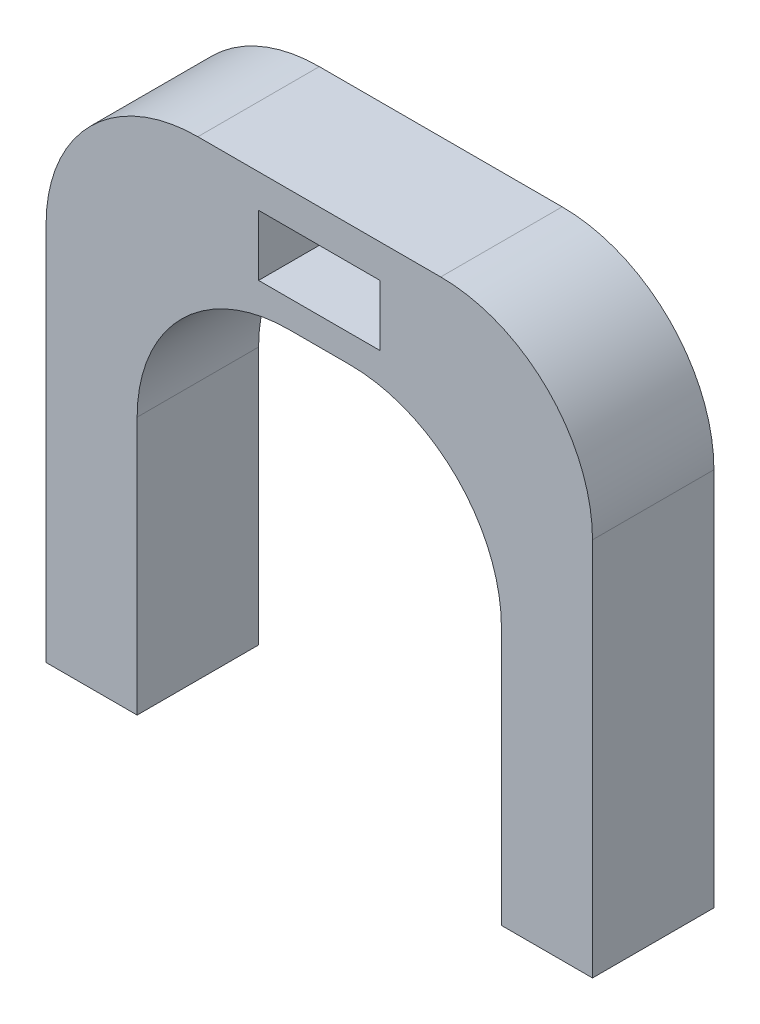
ISO-10303-21;
HEADER;
FILE_DESCRIPTION(('STEP AP214'),'2;1');
FILE_NAME('part.step','',(''),(''),'','','');
FILE_SCHEMA(('AUTOMOTIVE_DESIGN { 1 0 10303 214 1 1 1 1 }'));
ENDSEC;
DATA;
#1=APPLICATION_CONTEXT('core data for automotive mechanical design processes');
#2=APPLICATION_PROTOCOL_DEFINITION('international standard','automotive_design',2000,#1);
#3=PRODUCT_CONTEXT('',#1,'mechanical');
#4=PRODUCT('Part','Part','',(#3));
#5=PRODUCT_RELATED_PRODUCT_CATEGORY('part','',(#4));
#6=PRODUCT_DEFINITION_FORMATION('','',#4);
#7=PRODUCT_DEFINITION_CONTEXT('part definition',#1,'design');
#8=PRODUCT_DEFINITION('design','',#6,#7);
#9=PRODUCT_DEFINITION_SHAPE('','',#8);
#10=(LENGTH_UNIT() NAMED_UNIT(*) SI_UNIT(.MILLI.,.METRE.));
#11=(NAMED_UNIT(*) PLANE_ANGLE_UNIT() SI_UNIT($,.RADIAN.));
#12=(NAMED_UNIT(*) SI_UNIT($,.STERADIAN.) SOLID_ANGLE_UNIT());
#13=UNCERTAINTY_MEASURE_WITH_UNIT(LENGTH_MEASURE(1.E-05),#10,'distance_accuracy_value','');
#14=(GEOMETRIC_REPRESENTATION_CONTEXT(3) GLOBAL_UNCERTAINTY_ASSIGNED_CONTEXT((#13)) GLOBAL_UNIT_ASSIGNED_CONTEXT((#10,
#11,#12)) REPRESENTATION_CONTEXT('',''));
#15=CARTESIAN_POINT('',(0.,0.,0.));
#16=DIRECTION('',(0.,0.,1.));
#17=DIRECTION('',(1.,0.,0.));
#18=AXIS2_PLACEMENT_3D('',#15,#16,#17);
#19=CARTESIAN_POINT('',(0.,0.,4.));
#20=DIRECTION('',(1.,0.,0.));
#21=DIRECTION('',(0.,0.,-1.));
#22=AXIS2_PLACEMENT_3D('',#19,#20,#21);
#23=PLANE('',#22);
#24=DIRECTION('',(0.,-1.,0.));
#25=VECTOR('',#24,1.);
#26=CARTESIAN_POINT('',(0.,0.,0.));
#27=LINE('',#26,#25);
#28=CARTESIAN_POINT('',(0.,16.5,0.));
#29=VERTEX_POINT('',#28);
#30=CARTESIAN_POINT('',(0.,4.,0.));
#31=VERTEX_POINT('',#30);
#32=EDGE_CURVE('E167',#29,#31,#27,.T.);
#33=ORIENTED_EDGE('',*,*,#32,.T.);
#34=DIRECTION('',(0.,0.,1.));
#35=VECTOR('',#34,1.);
#36=CARTESIAN_POINT('',(0.,4.,0.));
#37=LINE('',#36,#35);
#38=CARTESIAN_POINT('',(0.,4.,4.));
#39=VERTEX_POINT('',#38);
#40=EDGE_CURVE('E286',#31,#39,#37,.T.);
#41=ORIENTED_EDGE('',*,*,#40,.T.);
#42=DIRECTION('',(0.,-1.,0.));
#43=VECTOR('',#42,1.);
#44=CARTESIAN_POINT('',(0.,0.,4.));
#45=LINE('',#44,#43);
#46=CARTESIAN_POINT('',(0.,16.5,4.));
#47=VERTEX_POINT('',#46);
#48=EDGE_CURVE('E170',#47,#39,#45,.T.);
#49=ORIENTED_EDGE('',*,*,#48,.F.);
#50=DIRECTION('',(0.,0.,-1.));
#51=VECTOR('',#50,1.);
#52=CARTESIAN_POINT('',(0.,16.5,4.));
#53=LINE('',#52,#51);
#54=EDGE_CURVE('E11',#47,#29,#53,.T.);
#55=ORIENTED_EDGE('',*,*,#54,.T.);
#56=EDGE_LOOP('',(#33,#41,#49,#55));
#57=FACE_BOUND('',#56,.T.);
#58=ADVANCED_FACE('F33',(#57),#23,.F.);
#59=CARTESIAN_POINT('',(18.,0.,4.));
#60=DIRECTION('',(-1.,0.,0.));
#61=DIRECTION('',(0.,0.,1.));
#62=AXIS2_PLACEMENT_3D('',#59,#60,#61);
#63=PLANE('',#62);
#64=DIRECTION('',(0.,1.,0.));
#65=VECTOR('',#64,1.);
#66=CARTESIAN_POINT('',(18.,0.,4.));
#67=LINE('',#66,#65);
#68=CARTESIAN_POINT('',(18.,4.,4.));
#69=VERTEX_POINT('',#68);
#70=CARTESIAN_POINT('',(18.,16.5,4.));
#71=VERTEX_POINT('',#70);
#72=EDGE_CURVE('E159',#69,#71,#67,.T.);
#73=ORIENTED_EDGE('',*,*,#72,.F.);
#74=DIRECTION('',(0.,0.,1.));
#75=VECTOR('',#74,1.);
#76=CARTESIAN_POINT('',(18.,4.,0.));
#77=LINE('',#76,#75);
#78=CARTESIAN_POINT('',(18.,4.,0.));
#79=VERTEX_POINT('',#78);
#80=EDGE_CURVE('E147',#79,#69,#77,.T.);
#81=ORIENTED_EDGE('',*,*,#80,.F.);
#82=DIRECTION('',(0.,1.,0.));
#83=VECTOR('',#82,1.);
#84=CARTESIAN_POINT('',(18.,0.,0.));
#85=LINE('',#84,#83);
#86=CARTESIAN_POINT('',(18.,16.5,0.));
#87=VERTEX_POINT('',#86);
#88=EDGE_CURVE('E157',#79,#87,#85,.T.);
#89=ORIENTED_EDGE('',*,*,#88,.T.);
#90=DIRECTION('',(0.,0.,-1.));
#91=VECTOR('',#90,1.);
#92=CARTESIAN_POINT('',(18.,16.5,4.));
#93=LINE('',#92,#91);
#94=EDGE_CURVE('E206',#87,#71,#93,.F.);
#95=ORIENTED_EDGE('',*,*,#94,.T.);
#96=EDGE_LOOP('',(#73,#81,#89,#95));
#97=FACE_BOUND('',#96,.T.);
#98=ADVANCED_FACE('F155',(#97),#63,.F.);
#99=CARTESIAN_POINT('',(0.,21.5,4.));
#100=DIRECTION('',(0.,-1.,0.));
#101=DIRECTION('',(0.,0.,-1.));
#102=AXIS2_PLACEMENT_3D('',#99,#100,#101);
#103=PLANE('',#102);
#104=DIRECTION('',(-1.,0.,0.));
#105=VECTOR('',#104,1.);
#106=CARTESIAN_POINT('',(0.,21.5,4.));
#107=LINE('',#106,#105);
#108=CARTESIAN_POINT('',(13.,21.5,4.));
#109=VERTEX_POINT('',#108);
#110=CARTESIAN_POINT('',(5.,21.5,4.));
#111=VERTEX_POINT('',#110);
#112=EDGE_CURVE('E180',#109,#111,#107,.T.);
#113=ORIENTED_EDGE('',*,*,#112,.F.);
#114=DIRECTION('',(0.,0.,-1.));
#115=VECTOR('',#114,1.);
#116=CARTESIAN_POINT('',(13.,21.5,4.));
#117=LINE('',#116,#115);
#118=CARTESIAN_POINT('',(13.,21.5,0.));
#119=VERTEX_POINT('',#118);
#120=EDGE_CURVE('E200',#109,#119,#117,.T.);
#121=ORIENTED_EDGE('',*,*,#120,.T.);
#122=DIRECTION('',(-1.,0.,0.));
#123=VECTOR('',#122,1.);
#124=CARTESIAN_POINT('',(0.,21.5,0.));
#125=LINE('',#124,#123);
#126=CARTESIAN_POINT('',(5.,21.5,0.));
#127=VERTEX_POINT('',#126);
#128=EDGE_CURVE('E166',#119,#127,#125,.T.);
#129=ORIENTED_EDGE('',*,*,#128,.T.);
#130=DIRECTION('',(0.,0.,-1.));
#131=VECTOR('',#130,1.);
#132=CARTESIAN_POINT('',(5.,21.5,4.));
#133=LINE('',#132,#131);
#134=EDGE_CURVE('E198',#127,#111,#133,.F.);
#135=ORIENTED_EDGE('',*,*,#134,.T.);
#136=EDGE_LOOP('',(#113,#121,#129,#135));
#137=FACE_BOUND('',#136,.T.);
#138=ADVANCED_FACE('F219',(#137),#103,.F.);
#139=CARTESIAN_POINT('',(0.,0.,4.));
#140=DIRECTION('',(0.,0.,-1.));
#141=DIRECTION('',(-1.,0.,0.));
#142=AXIS2_PLACEMENT_3D('',#139,#140,#141);
#143=PLANE('',#142);
#144=DIRECTION('',(1.,0.,0.));
#145=VECTOR('',#144,1.);
#146=CARTESIAN_POINT('',(7.,18.4009479824988,4.));
#147=LINE('',#146,#145);
#148=CARTESIAN_POINT('',(7.,18.4009479824988,4.));
#149=VERTEX_POINT('',#148);
#150=CARTESIAN_POINT('',(11.,18.4009479824988,4.));
#151=VERTEX_POINT('',#150);
#152=EDGE_CURVE('E312',#149,#151,#147,.T.);
#153=ORIENTED_EDGE('',*,*,#152,.F.);
#154=DIRECTION('',(0.,-1.,0.));
#155=VECTOR('',#154,1.);
#156=CARTESIAN_POINT('',(7.,20.4009479824988,4.));
#157=LINE('',#156,#155);
#158=CARTESIAN_POINT('',(7.,20.4009479824988,4.));
#159=VERTEX_POINT('',#158);
#160=EDGE_CURVE('E295',#159,#149,#157,.T.);
#161=ORIENTED_EDGE('',*,*,#160,.F.);
#162=DIRECTION('',(-1.,0.,0.));
#163=VECTOR('',#162,1.);
#164=CARTESIAN_POINT('',(7.,20.4009479824988,4.));
#165=LINE('',#164,#163);
#166=CARTESIAN_POINT('',(11.,20.4009479824988,4.));
#167=VERTEX_POINT('',#166);
#168=EDGE_CURVE('E301',#167,#159,#165,.T.);
#169=ORIENTED_EDGE('',*,*,#168,.F.);
#170=DIRECTION('',(0.,1.,0.));
#171=VECTOR('',#170,1.);
#172=CARTESIAN_POINT('',(11.,20.4009479824988,4.));
#173=LINE('',#172,#171);
#174=EDGE_CURVE('E315',#151,#167,#173,.T.);
#175=ORIENTED_EDGE('',*,*,#174,.F.);
#176=EDGE_LOOP('',(#153,#161,#169,#175));
#177=FACE_BOUND('',#176,.T.);
#178=DIRECTION('',(0.,1.,0.));
#179=VECTOR('',#178,1.);
#180=CARTESIAN_POINT('',(15.,0.,4.));
#181=LINE('',#180,#179);
#182=CARTESIAN_POINT('',(15.,4.,4.));
#183=VERTEX_POINT('',#182);
#184=CARTESIAN_POINT('',(15.,12.5,4.));
#185=VERTEX_POINT('',#184);
#186=EDGE_CURVE('E272',#183,#185,#181,.T.);
#187=ORIENTED_EDGE('',*,*,#186,.F.);
#188=DIRECTION('',(-1.,0.,0.));
#189=VECTOR('',#188,1.);
#190=CARTESIAN_POINT('',(15.,4.,4.));
#191=LINE('',#190,#189);
#192=EDGE_CURVE('E48',#69,#183,#191,.T.);
#193=ORIENTED_EDGE('',*,*,#192,.F.);
#194=ORIENTED_EDGE('',*,*,#72,.T.);
#195=CARTESIAN_POINT('',(13.,16.5,4.));
#196=DIRECTION('',(0.,0.,-1.));
#197=DIRECTION('',(-1.,0.,0.));
#198=AXIS2_PLACEMENT_3D('',#195,#196,#197);
#199=CIRCLE('',#198,5.);
#200=EDGE_CURVE('E41',#71,#109,#199,.F.);
#201=ORIENTED_EDGE('',*,*,#200,.T.);
#202=ORIENTED_EDGE('',*,*,#112,.T.);
#203=CARTESIAN_POINT('',(5.,16.5,4.));
#204=DIRECTION('',(0.,0.,-1.));
#205=DIRECTION('',(-1.,0.,0.));
#206=AXIS2_PLACEMENT_3D('',#203,#204,#205);
#207=CIRCLE('',#206,5.);
#208=EDGE_CURVE('E208',#111,#47,#207,.F.);
#209=ORIENTED_EDGE('',*,*,#208,.T.);
#210=ORIENTED_EDGE('',*,*,#48,.T.);
#211=DIRECTION('',(-1.,0.,0.));
#212=VECTOR('',#211,1.);
#213=CARTESIAN_POINT('',(0.,4.,4.));
#214=LINE('',#213,#212);
#215=CARTESIAN_POINT('',(3.,4.,4.));
#216=VERTEX_POINT('',#215);
#217=EDGE_CURVE('E282',#216,#39,#214,.T.);
#218=ORIENTED_EDGE('',*,*,#217,.F.);
#219=DIRECTION('',(0.,-1.,0.));
#220=VECTOR('',#219,1.);
#221=CARTESIAN_POINT('',(3.,0.,4.));
#222=LINE('',#221,#220);
#223=CARTESIAN_POINT('',(3.,12.5,4.));
#224=VERTEX_POINT('',#223);
#225=EDGE_CURVE('E269',#224,#216,#222,.T.);
#226=ORIENTED_EDGE('',*,*,#225,.F.);
#227=CARTESIAN_POINT('',(8.,12.5,4.));
#228=DIRECTION('',(0.,0.,-1.));
#229=DIRECTION('',(-1.,0.,0.));
#230=AXIS2_PLACEMENT_3D('',#227,#228,#229);
#231=CIRCLE('',#230,5.);
#232=CARTESIAN_POINT('',(8.,17.5,4.));
#233=VERTEX_POINT('',#232);
#234=EDGE_CURVE('E194',#224,#233,#231,.T.);
#235=ORIENTED_EDGE('',*,*,#234,.T.);
#236=DIRECTION('',(-1.,0.,0.));
#237=VECTOR('',#236,1.);
#238=CARTESIAN_POINT('',(3.,17.5,4.));
#239=LINE('',#238,#237);
#240=CARTESIAN_POINT('',(10.,17.5,4.));
#241=VERTEX_POINT('',#240);
#242=EDGE_CURVE('E275',#241,#233,#239,.T.);
#243=ORIENTED_EDGE('',*,*,#242,.F.);
#244=CARTESIAN_POINT('',(10.,12.5,4.));
#245=DIRECTION('',(0.,0.,-1.));
#246=DIRECTION('',(-1.,0.,0.));
#247=AXIS2_PLACEMENT_3D('',#244,#245,#246);
#248=CIRCLE('',#247,5.);
#249=EDGE_CURVE('E189',#241,#185,#248,.T.);
#250=ORIENTED_EDGE('',*,*,#249,.T.);
#251=EDGE_LOOP('',(#187,#193,#194,#201,#202,#209,#210,#218,#226,#235,#243,#250));
#252=FACE_BOUND('',#251,.T.);
#253=ADVANCED_FACE('F214',(#177,#252),#143,.F.);
#254=CARTESIAN_POINT('',(0.,0.,0.));
#255=DIRECTION('',(0.,0.,-1.));
#256=DIRECTION('',(-1.,0.,0.));
#257=AXIS2_PLACEMENT_3D('',#254,#255,#256);
#258=PLANE('',#257);
#259=DIRECTION('',(-1.,0.,0.));
#260=VECTOR('',#259,1.);
#261=CARTESIAN_POINT('',(15.,4.,0.));
#262=LINE('',#261,#260);
#263=CARTESIAN_POINT('',(15.,4.,0.));
#264=VERTEX_POINT('',#263);
#265=EDGE_CURVE('E144',#79,#264,#262,.T.);
#266=ORIENTED_EDGE('',*,*,#265,.T.);
#267=DIRECTION('',(0.,1.,0.));
#268=VECTOR('',#267,1.);
#269=CARTESIAN_POINT('',(15.,0.,0.));
#270=LINE('',#269,#268);
#271=CARTESIAN_POINT('',(15.,12.5,0.));
#272=VERTEX_POINT('',#271);
#273=EDGE_CURVE('E259',#264,#272,#270,.T.);
#274=ORIENTED_EDGE('',*,*,#273,.T.);
#275=CARTESIAN_POINT('',(10.,12.5,0.));
#276=DIRECTION('',(0.,0.,-1.));
#277=DIRECTION('',(-1.,0.,0.));
#278=AXIS2_PLACEMENT_3D('',#275,#276,#277);
#279=CIRCLE('',#278,5.);
#280=CARTESIAN_POINT('',(10.,17.5,0.));
#281=VERTEX_POINT('',#280);
#282=EDGE_CURVE('E192',#272,#281,#279,.F.);
#283=ORIENTED_EDGE('',*,*,#282,.T.);
#284=DIRECTION('',(-1.,0.,0.));
#285=VECTOR('',#284,1.);
#286=CARTESIAN_POINT('',(3.,17.5,0.));
#287=LINE('',#286,#285);
#288=CARTESIAN_POINT('',(8.,17.5,0.));
#289=VERTEX_POINT('',#288);
#290=EDGE_CURVE('E173',#281,#289,#287,.T.);
#291=ORIENTED_EDGE('',*,*,#290,.T.);
#292=CARTESIAN_POINT('',(8.,12.5,0.));
#293=DIRECTION('',(0.,0.,-1.));
#294=DIRECTION('',(-1.,0.,0.));
#295=AXIS2_PLACEMENT_3D('',#292,#293,#294);
#296=CIRCLE('',#295,5.);
#297=CARTESIAN_POINT('',(3.,12.5,0.));
#298=VERTEX_POINT('',#297);
#299=EDGE_CURVE('E196',#289,#298,#296,.F.);
#300=ORIENTED_EDGE('',*,*,#299,.T.);
#301=DIRECTION('',(0.,-1.,0.));
#302=VECTOR('',#301,1.);
#303=CARTESIAN_POINT('',(3.,0.,0.));
#304=LINE('',#303,#302);
#305=CARTESIAN_POINT('',(3.,4.,0.));
#306=VERTEX_POINT('',#305);
#307=EDGE_CURVE('E265',#298,#306,#304,.T.);
#308=ORIENTED_EDGE('',*,*,#307,.T.);
#309=DIRECTION('',(-1.,0.,0.));
#310=VECTOR('',#309,1.);
#311=CARTESIAN_POINT('',(0.,4.,0.));
#312=LINE('',#311,#310);
#313=EDGE_CURVE('E56',#306,#31,#312,.T.);
#314=ORIENTED_EDGE('',*,*,#313,.T.);
#315=ORIENTED_EDGE('',*,*,#32,.F.);
#316=CARTESIAN_POINT('',(5.,16.5,0.));
#317=DIRECTION('',(0.,0.,-1.));
#318=DIRECTION('',(-1.,0.,0.));
#319=AXIS2_PLACEMENT_3D('',#316,#317,#318);
#320=CIRCLE('',#319,5.);
#321=EDGE_CURVE('E203',#29,#127,#320,.T.);
#322=ORIENTED_EDGE('',*,*,#321,.T.);
#323=ORIENTED_EDGE('',*,*,#128,.F.);
#324=CARTESIAN_POINT('',(13.,16.5,0.));
#325=DIRECTION('',(0.,0.,-1.));
#326=DIRECTION('',(-1.,0.,0.));
#327=AXIS2_PLACEMENT_3D('',#324,#325,#326);
#328=CIRCLE('',#327,5.);
#329=EDGE_CURVE('E164',#119,#87,#328,.T.);
#330=ORIENTED_EDGE('',*,*,#329,.T.);
#331=ORIENTED_EDGE('',*,*,#88,.F.);
#332=EDGE_LOOP('',(#266,#274,#283,#291,#300,#308,#314,#315,#322,#323,#330,#331));
#333=FACE_BOUND('',#332,.T.);
#334=DIRECTION('',(0.,-1.,0.));
#335=VECTOR('',#334,1.);
#336=CARTESIAN_POINT('',(7.,20.4009479824988,0.));
#337=LINE('',#336,#335);
#338=CARTESIAN_POINT('',(7.,20.4009479824988,0.));
#339=VERTEX_POINT('',#338);
#340=CARTESIAN_POINT('',(7.,18.4009479824988,0.));
#341=VERTEX_POINT('',#340);
#342=EDGE_CURVE('E297',#339,#341,#337,.T.);
#343=ORIENTED_EDGE('',*,*,#342,.T.);
#344=DIRECTION('',(1.,0.,0.));
#345=VECTOR('',#344,1.);
#346=CARTESIAN_POINT('',(7.,18.4009479824988,0.));
#347=LINE('',#346,#345);
#348=CARTESIAN_POINT('',(11.,18.4009479824988,0.));
#349=VERTEX_POINT('',#348);
#350=EDGE_CURVE('E300',#341,#349,#347,.T.);
#351=ORIENTED_EDGE('',*,*,#350,.T.);
#352=DIRECTION('',(0.,1.,0.));
#353=VECTOR('',#352,1.);
#354=CARTESIAN_POINT('',(11.,20.4009479824988,0.));
#355=LINE('',#354,#353);
#356=CARTESIAN_POINT('',(11.,20.4009479824988,0.));
#357=VERTEX_POINT('',#356);
#358=EDGE_CURVE('E304',#349,#357,#355,.T.);
#359=ORIENTED_EDGE('',*,*,#358,.T.);
#360=DIRECTION('',(-1.,0.,0.));
#361=VECTOR('',#360,1.);
#362=CARTESIAN_POINT('',(7.,20.4009479824988,0.));
#363=LINE('',#362,#361);
#364=EDGE_CURVE('E307',#357,#339,#363,.T.);
#365=ORIENTED_EDGE('',*,*,#364,.T.);
#366=EDGE_LOOP('',(#343,#351,#359,#365));
#367=FACE_BOUND('',#366,.T.);
#368=ADVANCED_FACE('F161',(#333,#367),#258,.T.);
#369=CARTESIAN_POINT('',(3.,0.,0.));
#370=DIRECTION('',(-1.,0.,0.));
#371=DIRECTION('',(0.,0.,1.));
#372=AXIS2_PLACEMENT_3D('',#369,#370,#371);
#373=PLANE('',#372);
#374=ORIENTED_EDGE('',*,*,#225,.T.);
#375=DIRECTION('',(0.,0.,1.));
#376=VECTOR('',#375,1.);
#377=CARTESIAN_POINT('',(3.,4.,0.));
#378=LINE('',#377,#376);
#379=EDGE_CURVE('E289',#306,#216,#378,.T.);
#380=ORIENTED_EDGE('',*,*,#379,.F.);
#381=ORIENTED_EDGE('',*,*,#307,.F.);
#382=DIRECTION('',(0.,0.,1.));
#383=VECTOR('',#382,1.);
#384=CARTESIAN_POINT('',(3.,12.5,4.));
#385=LINE('',#384,#383);
#386=EDGE_CURVE('E186',#298,#224,#385,.T.);
#387=ORIENTED_EDGE('',*,*,#386,.T.);
#388=EDGE_LOOP('',(#374,#380,#381,#387));
#389=FACE_BOUND('',#388,.T.);
#390=ADVANCED_FACE('F357',(#389),#373,.F.);
#391=CARTESIAN_POINT('',(3.,17.5,0.));
#392=DIRECTION('',(0.,1.,0.));
#393=DIRECTION('',(0.,0.,1.));
#394=AXIS2_PLACEMENT_3D('',#391,#392,#393);
#395=PLANE('',#394);
#396=ORIENTED_EDGE('',*,*,#290,.F.);
#397=DIRECTION('',(0.,0.,1.));
#398=VECTOR('',#397,1.);
#399=CARTESIAN_POINT('',(10.,17.5,4.));
#400=LINE('',#399,#398);
#401=EDGE_CURVE('E179',#281,#241,#400,.T.);
#402=ORIENTED_EDGE('',*,*,#401,.T.);
#403=ORIENTED_EDGE('',*,*,#242,.T.);
#404=DIRECTION('',(0.,0.,1.));
#405=VECTOR('',#404,1.);
#406=CARTESIAN_POINT('',(8.,17.5,0.));
#407=LINE('',#406,#405);
#408=EDGE_CURVE('E177',#233,#289,#407,.F.);
#409=ORIENTED_EDGE('',*,*,#408,.T.);
#410=EDGE_LOOP('',(#396,#402,#403,#409));
#411=FACE_BOUND('',#410,.T.);
#412=ADVANCED_FACE('F250',(#411),#395,.F.);
#413=CARTESIAN_POINT('',(15.,0.,0.));
#414=DIRECTION('',(1.,0.,0.));
#415=DIRECTION('',(0.,0.,-1.));
#416=AXIS2_PLACEMENT_3D('',#413,#414,#415);
#417=PLANE('',#416);
#418=ORIENTED_EDGE('',*,*,#273,.F.);
#419=DIRECTION('',(0.,0.,1.));
#420=VECTOR('',#419,1.);
#421=CARTESIAN_POINT('',(15.,4.,0.));
#422=LINE('',#421,#420);
#423=EDGE_CURVE('E148',#264,#183,#422,.T.);
#424=ORIENTED_EDGE('',*,*,#423,.T.);
#425=ORIENTED_EDGE('',*,*,#186,.T.);
#426=DIRECTION('',(0.,0.,1.));
#427=VECTOR('',#426,1.);
#428=CARTESIAN_POINT('',(15.,12.5,0.));
#429=LINE('',#428,#427);
#430=EDGE_CURVE('E183',#185,#272,#429,.F.);
#431=ORIENTED_EDGE('',*,*,#430,.T.);
#432=EDGE_LOOP('',(#418,#424,#425,#431));
#433=FACE_BOUND('',#432,.T.);
#434=ADVANCED_FACE('F244',(#433),#417,.F.);
#435=CARTESIAN_POINT('',(10.,12.5,0.));
#436=DIRECTION('',(0.,0.,-1.));
#437=DIRECTION('',(-1.,0.,0.));
#438=AXIS2_PLACEMENT_3D('',#435,#436,#437);
#439=CYLINDRICAL_SURFACE('',#438,5.);
#440=ORIENTED_EDGE('',*,*,#282,.F.);
#441=ORIENTED_EDGE('',*,*,#430,.F.);
#442=ORIENTED_EDGE('',*,*,#249,.F.);
#443=ORIENTED_EDGE('',*,*,#401,.F.);
#444=EDGE_LOOP('',(#440,#441,#442,#443));
#445=FACE_BOUND('',#444,.T.);
#446=ADVANCED_FACE('F230',(#445),#439,.F.);
#447=CARTESIAN_POINT('',(8.,12.5,0.));
#448=DIRECTION('',(0.,0.,-1.));
#449=DIRECTION('',(-1.,0.,0.));
#450=AXIS2_PLACEMENT_3D('',#447,#448,#449);
#451=CYLINDRICAL_SURFACE('',#450,5.);
#452=ORIENTED_EDGE('',*,*,#299,.F.);
#453=ORIENTED_EDGE('',*,*,#408,.F.);
#454=ORIENTED_EDGE('',*,*,#234,.F.);
#455=ORIENTED_EDGE('',*,*,#386,.F.);
#456=EDGE_LOOP('',(#452,#453,#454,#455));
#457=FACE_BOUND('',#456,.T.);
#458=ADVANCED_FACE('F223',(#457),#451,.F.);
#459=CARTESIAN_POINT('',(13.,16.5,4.));
#460=DIRECTION('',(0.,0.,-1.));
#461=DIRECTION('',(-1.,0.,0.));
#462=AXIS2_PLACEMENT_3D('',#459,#460,#461);
#463=CYLINDRICAL_SURFACE('',#462,5.);
#464=ORIENTED_EDGE('',*,*,#200,.F.);
#465=ORIENTED_EDGE('',*,*,#94,.F.);
#466=ORIENTED_EDGE('',*,*,#329,.F.);
#467=ORIENTED_EDGE('',*,*,#120,.F.);
#468=EDGE_LOOP('',(#464,#465,#466,#467));
#469=FACE_BOUND('',#468,.T.);
#470=ADVANCED_FACE('F221',(#469),#463,.T.);
#471=CARTESIAN_POINT('',(5.,16.5,4.));
#472=DIRECTION('',(0.,0.,-1.));
#473=DIRECTION('',(-1.,0.,0.));
#474=AXIS2_PLACEMENT_3D('',#471,#472,#473);
#475=CYLINDRICAL_SURFACE('',#474,5.);
#476=ORIENTED_EDGE('',*,*,#208,.F.);
#477=ORIENTED_EDGE('',*,*,#134,.F.);
#478=ORIENTED_EDGE('',*,*,#321,.F.);
#479=ORIENTED_EDGE('',*,*,#54,.F.);
#480=EDGE_LOOP('',(#476,#477,#478,#479));
#481=FACE_BOUND('',#480,.T.);
#482=ADVANCED_FACE('F35',(#481),#475,.T.);
#483=CARTESIAN_POINT('',(7.,20.4009479824988,0.));
#484=DIRECTION('',(-1.,0.,0.));
#485=DIRECTION('',(0.,0.,1.));
#486=AXIS2_PLACEMENT_3D('',#483,#484,#485);
#487=PLANE('',#486);
#488=ORIENTED_EDGE('',*,*,#160,.T.);
#489=DIRECTION('',(0.,0.,1.));
#490=VECTOR('',#489,1.);
#491=CARTESIAN_POINT('',(7.,18.4009479824988,0.));
#492=LINE('',#491,#490);
#493=EDGE_CURVE('E310',#341,#149,#492,.T.);
#494=ORIENTED_EDGE('',*,*,#493,.F.);
#495=ORIENTED_EDGE('',*,*,#342,.F.);
#496=DIRECTION('',(0.,0.,1.));
#497=VECTOR('',#496,1.);
#498=CARTESIAN_POINT('',(7.,20.4009479824988,0.));
#499=LINE('',#498,#497);
#500=EDGE_CURVE('E273',#339,#159,#499,.T.);
#501=ORIENTED_EDGE('',*,*,#500,.T.);
#502=EDGE_LOOP('',(#488,#494,#495,#501));
#503=FACE_BOUND('',#502,.T.);
#504=ADVANCED_FACE('F228',(#503),#487,.F.);
#505=CARTESIAN_POINT('',(7.,20.4009479824988,0.));
#506=DIRECTION('',(0.,1.,0.));
#507=DIRECTION('',(0.,0.,1.));
#508=AXIS2_PLACEMENT_3D('',#505,#506,#507);
#509=PLANE('',#508);
#510=ORIENTED_EDGE('',*,*,#168,.T.);
#511=ORIENTED_EDGE('',*,*,#500,.F.);
#512=ORIENTED_EDGE('',*,*,#364,.F.);
#513=DIRECTION('',(0.,0.,1.));
#514=VECTOR('',#513,1.);
#515=CARTESIAN_POINT('',(11.,20.4009479824988,0.));
#516=LINE('',#515,#514);
#517=EDGE_CURVE('E321',#357,#167,#516,.T.);
#518=ORIENTED_EDGE('',*,*,#517,.T.);
#519=EDGE_LOOP('',(#510,#511,#512,#518));
#520=FACE_BOUND('',#519,.T.);
#521=ADVANCED_FACE('F341',(#520),#509,.F.);
#522=CARTESIAN_POINT('',(11.,20.4009479824988,0.));
#523=DIRECTION('',(1.,0.,0.));
#524=DIRECTION('',(0.,0.,-1.));
#525=AXIS2_PLACEMENT_3D('',#522,#523,#524);
#526=PLANE('',#525);
#527=ORIENTED_EDGE('',*,*,#174,.T.);
#528=ORIENTED_EDGE('',*,*,#517,.F.);
#529=ORIENTED_EDGE('',*,*,#358,.F.);
#530=DIRECTION('',(0.,0.,1.));
#531=VECTOR('',#530,1.);
#532=CARTESIAN_POINT('',(11.,18.4009479824988,0.));
#533=LINE('',#532,#531);
#534=EDGE_CURVE('E323',#349,#151,#533,.T.);
#535=ORIENTED_EDGE('',*,*,#534,.T.);
#536=EDGE_LOOP('',(#527,#528,#529,#535));
#537=FACE_BOUND('',#536,.T.);
#538=ADVANCED_FACE('F338',(#537),#526,.F.);
#539=CARTESIAN_POINT('',(7.,18.4009479824988,0.));
#540=DIRECTION('',(0.,-1.,0.));
#541=DIRECTION('',(0.,0.,-1.));
#542=AXIS2_PLACEMENT_3D('',#539,#540,#541);
#543=PLANE('',#542);
#544=ORIENTED_EDGE('',*,*,#152,.T.);
#545=ORIENTED_EDGE('',*,*,#534,.F.);
#546=ORIENTED_EDGE('',*,*,#350,.F.);
#547=ORIENTED_EDGE('',*,*,#493,.T.);
#548=EDGE_LOOP('',(#544,#545,#546,#547));
#549=FACE_BOUND('',#548,.T.);
#550=ADVANCED_FACE('F329',(#549),#543,.F.);
#551=CARTESIAN_POINT('',(0.,4.,0.));
#552=DIRECTION('',(0.,1.,0.));
#553=DIRECTION('',(0.,0.,1.));
#554=AXIS2_PLACEMENT_3D('',#551,#552,#553);
#555=PLANE('',#554);
#556=ORIENTED_EDGE('',*,*,#217,.T.);
#557=ORIENTED_EDGE('',*,*,#40,.F.);
#558=ORIENTED_EDGE('',*,*,#313,.F.);
#559=ORIENTED_EDGE('',*,*,#379,.T.);
#560=EDGE_LOOP('',(#556,#557,#558,#559));
#561=FACE_BOUND('',#560,.T.);
#562=ADVANCED_FACE('F351',(#561),#555,.F.);
#563=CARTESIAN_POINT('',(15.,4.,0.));
#564=DIRECTION('',(0.,1.,0.));
#565=DIRECTION('',(0.,0.,1.));
#566=AXIS2_PLACEMENT_3D('',#563,#564,#565);
#567=PLANE('',#566);
#568=ORIENTED_EDGE('',*,*,#192,.T.);
#569=ORIENTED_EDGE('',*,*,#423,.F.);
#570=ORIENTED_EDGE('',*,*,#265,.F.);
#571=ORIENTED_EDGE('',*,*,#80,.T.);
#572=EDGE_LOOP('',(#568,#569,#570,#571));
#573=FACE_BOUND('',#572,.T.);
#574=ADVANCED_FACE('F146',(#573),#567,.F.);
#575=CLOSED_SHELL('',(#58,#98,#138,#253,#368,#390,#412,#434,#446,#458,#470,#482,#504,#521,#538,
#550,#562,#574));
#576=MANIFOLD_SOLID_BREP('B2',#575);
#577=ADVANCED_BREP_SHAPE_REPRESENTATION('',(#18,#576),#14);
#578=SHAPE_DEFINITION_REPRESENTATION(#9,#577);
ENDSEC;
END-ISO-10303-21;
